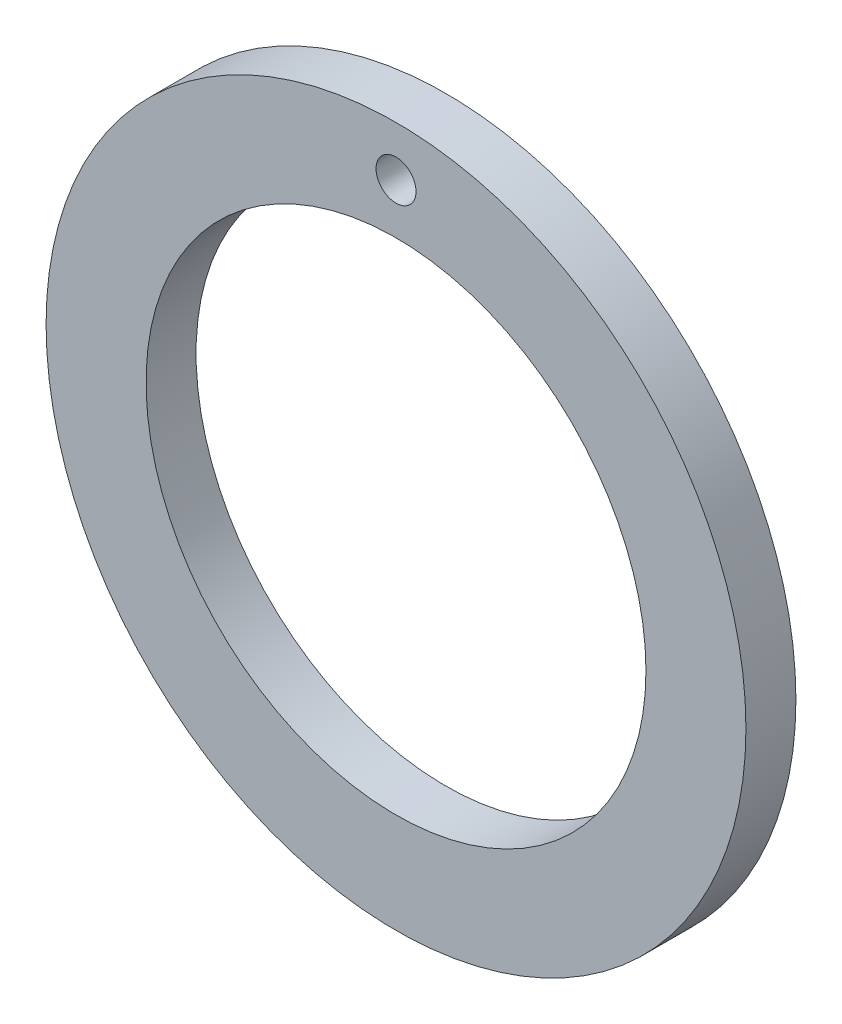
ISO-10303-21;
HEADER;
FILE_DESCRIPTION(('STEP AP214'),'2;1');
FILE_NAME('part.step','',(''),(''),'','','');
FILE_SCHEMA(('AUTOMOTIVE_DESIGN { 1 0 10303 214 1 1 1 1 }'));
ENDSEC;
DATA;
#1=APPLICATION_CONTEXT('core data for automotive mechanical design processes');
#2=APPLICATION_PROTOCOL_DEFINITION('international standard','automotive_design',2000,#1);
#3=PRODUCT_CONTEXT('',#1,'mechanical');
#4=PRODUCT('Part','Part','',(#3));
#5=PRODUCT_RELATED_PRODUCT_CATEGORY('part','',(#4));
#6=PRODUCT_DEFINITION_FORMATION('','',#4);
#7=PRODUCT_DEFINITION_CONTEXT('part definition',#1,'design');
#8=PRODUCT_DEFINITION('design','',#6,#7);
#9=PRODUCT_DEFINITION_SHAPE('','',#8);
#10=(LENGTH_UNIT() NAMED_UNIT(*) SI_UNIT(.MILLI.,.METRE.));
#11=(NAMED_UNIT(*) PLANE_ANGLE_UNIT() SI_UNIT($,.RADIAN.));
#12=(NAMED_UNIT(*) SI_UNIT($,.STERADIAN.) SOLID_ANGLE_UNIT());
#13=UNCERTAINTY_MEASURE_WITH_UNIT(LENGTH_MEASURE(1.E-05),#10,'distance_accuracy_value','');
#14=(GEOMETRIC_REPRESENTATION_CONTEXT(3) GLOBAL_UNCERTAINTY_ASSIGNED_CONTEXT((#13)) GLOBAL_UNIT_ASSIGNED_CONTEXT((#10,
#11,#12)) REPRESENTATION_CONTEXT('',''));
#15=CARTESIAN_POINT('',(0.,0.,0.));
#16=DIRECTION('',(0.,0.,1.));
#17=DIRECTION('',(1.,0.,0.));
#18=AXIS2_PLACEMENT_3D('',#15,#16,#17);
#19=CARTESIAN_POINT('',(0.,0.,0.79375));
#20=DIRECTION('',(0.,0.,1.));
#21=DIRECTION('',(1.,0.,0.));
#22=AXIS2_PLACEMENT_3D('',#19,#20,#21);
#23=PLANE('',#22);
#24=CARTESIAN_POINT('',(0.,0.,0.79375));
#25=DIRECTION('',(0.,0.,1.));
#26=DIRECTION('',(1.,0.,0.));
#27=AXIS2_PLACEMENT_3D('',#24,#25,#26);
#28=CIRCLE('',#27,7.9375);
#29=CARTESIAN_POINT('',(7.9375,0.,0.79375));
#30=VERTEX_POINT('',#29);
#31=EDGE_CURVE('E53',#30,#30,#28,.T.);
#32=ORIENTED_EDGE('',*,*,#31,.F.);
#33=EDGE_LOOP('',(#32));
#34=FACE_BOUND('',#33,.T.);
#35=CARTESIAN_POINT('',(0.,0.,0.79375));
#36=DIRECTION('',(0.,0.,1.));
#37=DIRECTION('',(1.,0.,0.));
#38=AXIS2_PLACEMENT_3D('',#35,#36,#37);
#39=CIRCLE('',#38,11.1125);
#40=CARTESIAN_POINT('',(11.1125,0.,0.79375));
#41=VERTEX_POINT('',#40);
#42=EDGE_CURVE('E10',#41,#41,#39,.T.);
#43=ORIENTED_EDGE('',*,*,#42,.T.);
#44=EDGE_LOOP('',(#43));
#45=FACE_BOUND('',#44,.T.);
#46=CARTESIAN_POINT('',(0.,9.525,0.79375));
#47=DIRECTION('',(0.,0.,1.));
#48=DIRECTION('',(1.,0.,0.));
#49=AXIS2_PLACEMENT_3D('',#46,#47,#48);
#50=CIRCLE('',#49,0.635);
#51=CARTESIAN_POINT('',(0.635,9.525,0.79375));
#52=VERTEX_POINT('',#51);
#53=EDGE_CURVE('E58',#52,#52,#50,.T.);
#54=ORIENTED_EDGE('',*,*,#53,.F.);
#55=EDGE_LOOP('',(#54));
#56=FACE_BOUND('',#55,.T.);
#57=ADVANCED_FACE('F42',(#34,#45,#56),#23,.T.);
#58=CARTESIAN_POINT('',(0.,0.,-0.79375));
#59=DIRECTION('',(0.,0.,1.));
#60=DIRECTION('',(1.,0.,0.));
#61=AXIS2_PLACEMENT_3D('',#58,#59,#60);
#62=PLANE('',#61);
#63=CARTESIAN_POINT('',(0.,0.,-0.79375));
#64=DIRECTION('',(0.,0.,1.));
#65=DIRECTION('',(1.,0.,0.));
#66=AXIS2_PLACEMENT_3D('',#63,#64,#65);
#67=CIRCLE('',#66,11.1125);
#68=CARTESIAN_POINT('',(11.1125,0.,-0.79375));
#69=VERTEX_POINT('',#68);
#70=EDGE_CURVE('E46',#69,#69,#67,.T.);
#71=ORIENTED_EDGE('',*,*,#70,.F.);
#72=EDGE_LOOP('',(#71));
#73=FACE_BOUND('',#72,.T.);
#74=CARTESIAN_POINT('',(0.,0.,-0.79375));
#75=DIRECTION('',(0.,0.,1.));
#76=DIRECTION('',(1.,0.,0.));
#77=AXIS2_PLACEMENT_3D('',#74,#75,#76);
#78=CIRCLE('',#77,7.9375);
#79=CARTESIAN_POINT('',(7.9375,0.,-0.79375));
#80=VERTEX_POINT('',#79);
#81=EDGE_CURVE('E55',#80,#80,#78,.T.);
#82=ORIENTED_EDGE('',*,*,#81,.T.);
#83=EDGE_LOOP('',(#82));
#84=FACE_BOUND('',#83,.T.);
#85=CARTESIAN_POINT('',(0.,9.525,-0.79375));
#86=DIRECTION('',(0.,0.,1.));
#87=DIRECTION('',(1.,0.,0.));
#88=AXIS2_PLACEMENT_3D('',#85,#86,#87);
#89=CIRCLE('',#88,0.635);
#90=CARTESIAN_POINT('',(0.635,9.525,-0.79375));
#91=VERTEX_POINT('',#90);
#92=EDGE_CURVE('E61',#91,#91,#89,.T.);
#93=ORIENTED_EDGE('',*,*,#92,.T.);
#94=EDGE_LOOP('',(#93));
#95=FACE_BOUND('',#94,.T.);
#96=ADVANCED_FACE('F71',(#73,#84,#95),#62,.F.);
#97=CARTESIAN_POINT('',(0.,0.,0.79375));
#98=DIRECTION('',(0.,0.,-1.));
#99=DIRECTION('',(-1.,0.,0.));
#100=AXIS2_PLACEMENT_3D('',#97,#98,#99);
#101=CYLINDRICAL_SURFACE('',#100,11.1125);
#102=ORIENTED_EDGE('',*,*,#42,.F.);
#103=EDGE_LOOP('',(#102));
#104=FACE_BOUND('',#103,.T.);
#105=ORIENTED_EDGE('',*,*,#70,.T.);
#106=EDGE_LOOP('',(#105));
#107=FACE_BOUND('',#106,.T.);
#108=ADVANCED_FACE('F44',(#104,#107),#101,.T.);
#109=CARTESIAN_POINT('',(0.,0.,0.79375));
#110=DIRECTION('',(0.,0.,-1.));
#111=DIRECTION('',(-1.,0.,0.));
#112=AXIS2_PLACEMENT_3D('',#109,#110,#111);
#113=CYLINDRICAL_SURFACE('',#112,7.9375);
#114=ORIENTED_EDGE('',*,*,#31,.T.);
#115=EDGE_LOOP('',(#114));
#116=FACE_BOUND('',#115,.T.);
#117=ORIENTED_EDGE('',*,*,#81,.F.);
#118=EDGE_LOOP('',(#117));
#119=FACE_BOUND('',#118,.T.);
#120=ADVANCED_FACE('F81',(#116,#119),#113,.F.);
#121=CARTESIAN_POINT('',(0.,9.525,0.79375));
#122=DIRECTION('',(0.,0.,-1.));
#123=DIRECTION('',(-1.,0.,0.));
#124=AXIS2_PLACEMENT_3D('',#121,#122,#123);
#125=CYLINDRICAL_SURFACE('',#124,0.635);
#126=ORIENTED_EDGE('',*,*,#53,.T.);
#127=EDGE_LOOP('',(#126));
#128=FACE_BOUND('',#127,.T.);
#129=ORIENTED_EDGE('',*,*,#92,.F.);
#130=EDGE_LOOP('',(#129));
#131=FACE_BOUND('',#130,.T.);
#132=ADVANCED_FACE('F67',(#128,#131),#125,.F.);
#133=CLOSED_SHELL('',(#57,#96,#108,#120,#132));
#134=MANIFOLD_SOLID_BREP('B2',#133);
#135=ADVANCED_BREP_SHAPE_REPRESENTATION('',(#18,#134),#14);
#136=SHAPE_DEFINITION_REPRESENTATION(#9,#135);
ENDSEC;
END-ISO-10303-21;
